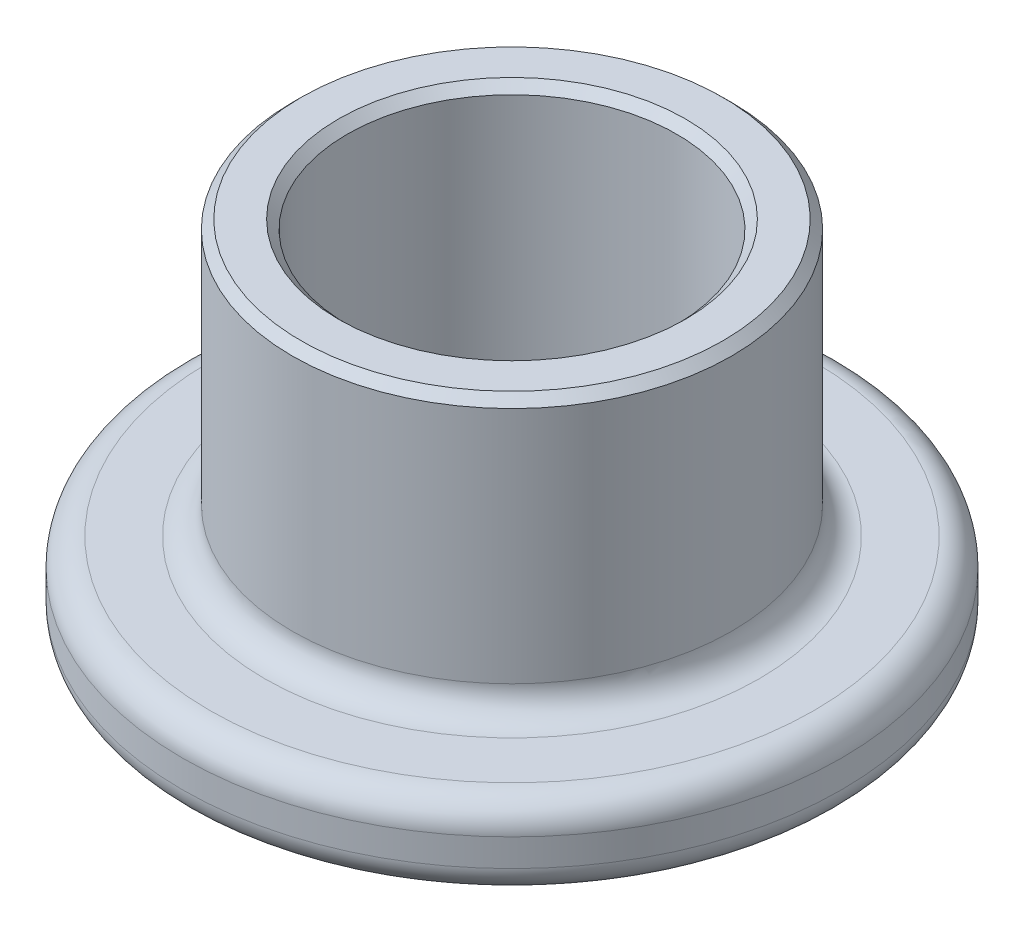
ISO-10303-21;
HEADER;
FILE_DESCRIPTION(('STEP AP214'),'2;1');
FILE_NAME('part.step','',(''),(''),'','','');
FILE_SCHEMA(('AUTOMOTIVE_DESIGN { 1 0 10303 214 1 1 1 1 }'));
ENDSEC;
DATA;
#1=APPLICATION_CONTEXT('core data for automotive mechanical design processes');
#2=APPLICATION_PROTOCOL_DEFINITION('international standard','automotive_design',2000,#1);
#3=PRODUCT_CONTEXT('',#1,'mechanical');
#4=PRODUCT('Part','Part','',(#3));
#5=PRODUCT_RELATED_PRODUCT_CATEGORY('part','',(#4));
#6=PRODUCT_DEFINITION_FORMATION('','',#4);
#7=PRODUCT_DEFINITION_CONTEXT('part definition',#1,'design');
#8=PRODUCT_DEFINITION('design','',#6,#7);
#9=PRODUCT_DEFINITION_SHAPE('','',#8);
#10=(LENGTH_UNIT() NAMED_UNIT(*) SI_UNIT(.MILLI.,.METRE.));
#11=(NAMED_UNIT(*) PLANE_ANGLE_UNIT() SI_UNIT($,.RADIAN.));
#12=(NAMED_UNIT(*) SI_UNIT($,.STERADIAN.) SOLID_ANGLE_UNIT());
#13=UNCERTAINTY_MEASURE_WITH_UNIT(LENGTH_MEASURE(1.E-05),#10,'distance_accuracy_value','');
#14=(GEOMETRIC_REPRESENTATION_CONTEXT(3) GLOBAL_UNCERTAINTY_ASSIGNED_CONTEXT((#13)) GLOBAL_UNIT_ASSIGNED_CONTEXT((#10,
#11,#12)) REPRESENTATION_CONTEXT('',''));
#15=CARTESIAN_POINT('',(0.,0.,0.));
#16=DIRECTION('',(0.,0.,1.));
#17=DIRECTION('',(1.,0.,0.));
#18=AXIS2_PLACEMENT_3D('',#15,#16,#17);
#19=CARTESIAN_POINT('',(0.,1.89666781767956,0.));
#20=DIRECTION('',(0.,1.,0.));
#21=DIRECTION('',(-1.,0.,0.));
#22=AXIS2_PLACEMENT_3D('',#19,#20,#21);
#23=CYLINDRICAL_SURFACE('',#22,2.38125);
#24=CARTESIAN_POINT('',(0.,0.127000000000002,0.));
#25=DIRECTION('',(0.,1.,0.));
#26=DIRECTION('',(-1.,0.,0.));
#27=AXIS2_PLACEMENT_3D('',#24,#25,#26);
#28=CIRCLE('',#27,2.38125);
#29=CARTESIAN_POINT('',(-2.38125,0.127000000000002,0.));
#30=VERTEX_POINT('',#29);
#31=EDGE_CURVE('E47',#30,#30,#28,.F.);
#32=ORIENTED_EDGE('',*,*,#31,.T.);
#33=EDGE_LOOP('',(#32));
#34=FACE_BOUND('',#33,.T.);
#35=CARTESIAN_POINT('',(0.,5.032375,0.));
#36=DIRECTION('',(0.,-1.,0.));
#37=DIRECTION('',(1.,0.,0.));
#38=AXIS2_PLACEMENT_3D('',#35,#36,#37);
#39=CIRCLE('',#38,2.38125);
#40=CARTESIAN_POINT('',(2.38125,5.032375,0.));
#41=VERTEX_POINT('',#40);
#42=EDGE_CURVE('E52',#41,#41,#39,.F.);
#43=ORIENTED_EDGE('',*,*,#42,.T.);
#44=EDGE_LOOP('',(#43));
#45=FACE_BOUND('',#44,.T.);
#46=ADVANCED_FACE('F32',(#34,#45),#23,.F.);
#47=CARTESIAN_POINT('',(2.38125,0.,0.));
#48=DIRECTION('',(0.,1.,0.));
#49=DIRECTION('',(-1.,0.,0.));
#50=AXIS2_PLACEMENT_3D('',#47,#48,#49);
#51=PLANE('',#50);
#52=CARTESIAN_POINT('',(0.,0.,0.));
#53=DIRECTION('',(0.,1.,0.));
#54=DIRECTION('',(-1.,0.,0.));
#55=AXIS2_PLACEMENT_3D('',#52,#53,#54);
#56=CIRCLE('',#55,2.50825);
#57=CARTESIAN_POINT('',(-2.50825,0.,0.));
#58=VERTEX_POINT('',#57);
#59=EDGE_CURVE('E55',#58,#58,#56,.T.);
#60=ORIENTED_EDGE('',*,*,#59,.T.);
#61=EDGE_LOOP('',(#60));
#62=FACE_BOUND('',#61,.T.);
#63=CARTESIAN_POINT('',(0.,0.,0.));
#64=DIRECTION('',(0.,1.,0.));
#65=DIRECTION('',(-1.,0.,0.));
#66=AXIS2_PLACEMENT_3D('',#63,#64,#65);
#67=CIRCLE('',#66,4.365625);
#68=CARTESIAN_POINT('',(-4.365625,0.,0.));
#69=VERTEX_POINT('',#68);
#70=EDGE_CURVE('E67',#69,#69,#67,.F.);
#71=ORIENTED_EDGE('',*,*,#70,.T.);
#72=EDGE_LOOP('',(#71));
#73=FACE_BOUND('',#72,.T.);
#74=ADVANCED_FACE('F108',(#62,#73),#51,.F.);
#75=CARTESIAN_POINT('',(0.,1.89666781767956,0.));
#76=DIRECTION('',(0.,1.,0.));
#77=DIRECTION('',(-1.,0.,0.));
#78=AXIS2_PLACEMENT_3D('',#75,#76,#77);
#79=CYLINDRICAL_SURFACE('',#78,4.7625);
#80=CARTESIAN_POINT('',(0.,0.396875,0.));
#81=DIRECTION('',(0.,1.,0.));
#82=DIRECTION('',(-1.,0.,0.));
#83=AXIS2_PLACEMENT_3D('',#80,#81,#82);
#84=CIRCLE('',#83,4.7625);
#85=CARTESIAN_POINT('',(-4.7625,0.396874999999999,0.));
#86=VERTEX_POINT('',#85);
#87=EDGE_CURVE('E70',#86,#86,#84,.T.);
#88=ORIENTED_EDGE('',*,*,#87,.T.);
#89=EDGE_LOOP('',(#88));
#90=FACE_BOUND('',#89,.T.);
#91=CARTESIAN_POINT('',(0.,0.793749999999999,0.));
#92=DIRECTION('',(0.,-1.,0.));
#93=DIRECTION('',(1.,0.,0.));
#94=AXIS2_PLACEMENT_3D('',#91,#92,#93);
#95=CIRCLE('',#94,4.7625);
#96=CARTESIAN_POINT('',(4.7625,0.79375,0.));
#97=VERTEX_POINT('',#96);
#98=EDGE_CURVE('E73',#97,#97,#95,.T.);
#99=ORIENTED_EDGE('',*,*,#98,.T.);
#100=EDGE_LOOP('',(#99));
#101=FACE_BOUND('',#100,.T.);
#102=ADVANCED_FACE('F77',(#90,#101),#79,.T.);
#103=CARTESIAN_POINT('',(4.7625,1.190625,0.));
#104=DIRECTION('',(0.,-1.,0.));
#105=DIRECTION('',(1.,0.,0.));
#106=AXIS2_PLACEMENT_3D('',#103,#104,#105);
#107=PLANE('',#106);
#108=CARTESIAN_POINT('',(0.,1.190625,0.));
#109=DIRECTION('',(0.,-1.,0.));
#110=DIRECTION('',(1.,0.,0.));
#111=AXIS2_PLACEMENT_3D('',#108,#109,#110);
#112=CIRCLE('',#111,4.365625);
#113=CARTESIAN_POINT('',(4.365625,1.190625,0.));
#114=VERTEX_POINT('',#113);
#115=EDGE_CURVE('E61',#114,#114,#112,.F.);
#116=ORIENTED_EDGE('',*,*,#115,.T.);
#117=EDGE_LOOP('',(#116));
#118=FACE_BOUND('',#117,.T.);
#119=CARTESIAN_POINT('',(0.,1.190625,0.));
#120=DIRECTION('',(0.,-1.,0.));
#121=DIRECTION('',(1.,0.,0.));
#122=AXIS2_PLACEMENT_3D('',#119,#120,#121);
#123=CIRCLE('',#122,3.571875);
#124=CARTESIAN_POINT('',(3.571875,1.190625,0.));
#125=VERTEX_POINT('',#124);
#126=EDGE_CURVE('E64',#125,#125,#123,.T.);
#127=ORIENTED_EDGE('',*,*,#126,.T.);
#128=EDGE_LOOP('',(#127));
#129=FACE_BOUND('',#128,.T.);
#130=ADVANCED_FACE('F87',(#118,#129),#107,.F.);
#131=CARTESIAN_POINT('',(0.,1.89666781767956,0.));
#132=DIRECTION('',(0.,1.,0.));
#133=DIRECTION('',(-1.,0.,0.));
#134=AXIS2_PLACEMENT_3D('',#131,#132,#133);
#135=CYLINDRICAL_SURFACE('',#134,3.175);
#136=CARTESIAN_POINT('',(0.,5.032375,0.));
#137=DIRECTION('',(0.,-1.,0.));
#138=DIRECTION('',(1.,0.,0.));
#139=AXIS2_PLACEMENT_3D('',#136,#137,#138);
#140=CIRCLE('',#139,3.175);
#141=CARTESIAN_POINT('',(3.175,5.032375,0.));
#142=VERTEX_POINT('',#141);
#143=EDGE_CURVE('E10',#142,#142,#140,.T.);
#144=ORIENTED_EDGE('',*,*,#143,.T.);
#145=EDGE_LOOP('',(#144));
#146=FACE_BOUND('',#145,.T.);
#147=CARTESIAN_POINT('',(0.,1.5875,0.));
#148=DIRECTION('',(0.,-1.,0.));
#149=DIRECTION('',(1.,0.,0.));
#150=AXIS2_PLACEMENT_3D('',#147,#148,#149);
#151=CIRCLE('',#150,3.175);
#152=CARTESIAN_POINT('',(3.175,1.5875,0.));
#153=VERTEX_POINT('',#152);
#154=EDGE_CURVE('E58',#153,#153,#151,.F.);
#155=ORIENTED_EDGE('',*,*,#154,.T.);
#156=EDGE_LOOP('',(#155));
#157=FACE_BOUND('',#156,.T.);
#158=ADVANCED_FACE('F90',(#146,#157),#135,.T.);
#159=CARTESIAN_POINT('',(3.175,5.159375,0.));
#160=DIRECTION('',(0.,-1.,0.));
#161=DIRECTION('',(1.,0.,0.));
#162=AXIS2_PLACEMENT_3D('',#159,#160,#161);
#163=PLANE('',#162);
#164=CARTESIAN_POINT('',(0.,5.159375,0.));
#165=DIRECTION('',(0.,-1.,0.));
#166=DIRECTION('',(1.,0.,0.));
#167=AXIS2_PLACEMENT_3D('',#164,#165,#166);
#168=CIRCLE('',#167,3.048);
#169=CARTESIAN_POINT('',(3.048,5.159375,0.));
#170=VERTEX_POINT('',#169);
#171=EDGE_CURVE('E39',#170,#170,#168,.F.);
#172=ORIENTED_EDGE('',*,*,#171,.T.);
#173=EDGE_LOOP('',(#172));
#174=FACE_BOUND('',#173,.T.);
#175=CARTESIAN_POINT('',(0.,5.159375,0.));
#176=DIRECTION('',(0.,-1.,0.));
#177=DIRECTION('',(1.,0.,0.));
#178=AXIS2_PLACEMENT_3D('',#175,#176,#177);
#179=CIRCLE('',#178,2.50825);
#180=CARTESIAN_POINT('',(2.50825,5.159375,0.));
#181=VERTEX_POINT('',#180);
#182=EDGE_CURVE('E43',#181,#181,#179,.T.);
#183=ORIENTED_EDGE('',*,*,#182,.T.);
#184=EDGE_LOOP('',(#183));
#185=FACE_BOUND('',#184,.T.);
#186=ADVANCED_FACE('F101',(#174,#185),#163,.F.);
#187=CARTESIAN_POINT('',(0.,0.396875,0.));
#188=DIRECTION('',(0.,1.,0.));
#189=DIRECTION('',(-1.,0.,0.));
#190=AXIS2_PLACEMENT_3D('',#187,#188,#189);
#191=TOROIDAL_SURFACE('',#190,4.365625,0.396875);
#192=ORIENTED_EDGE('',*,*,#70,.F.);
#193=EDGE_LOOP('',(#192));
#194=FACE_BOUND('',#193,.T.);
#195=ORIENTED_EDGE('',*,*,#87,.F.);
#196=EDGE_LOOP('',(#195));
#197=FACE_BOUND('',#196,.T.);
#198=ADVANCED_FACE('F83',(#194,#197),#191,.T.);
#199=CARTESIAN_POINT('',(0.,0.793749999999999,0.));
#200=DIRECTION('',(0.,-1.,0.));
#201=DIRECTION('',(1.,0.,0.));
#202=AXIS2_PLACEMENT_3D('',#199,#200,#201);
#203=TOROIDAL_SURFACE('',#202,4.365625,0.396875);
#204=ORIENTED_EDGE('',*,*,#98,.F.);
#205=EDGE_LOOP('',(#204));
#206=FACE_BOUND('',#205,.T.);
#207=ORIENTED_EDGE('',*,*,#115,.F.);
#208=EDGE_LOOP('',(#207));
#209=FACE_BOUND('',#208,.T.);
#210=ADVANCED_FACE('F79',(#206,#209),#203,.T.);
#211=CARTESIAN_POINT('',(0.,1.5875,0.));
#212=DIRECTION('',(0.,-1.,0.));
#213=DIRECTION('',(1.,0.,0.));
#214=AXIS2_PLACEMENT_3D('',#211,#212,#213);
#215=TOROIDAL_SURFACE('',#214,3.571875,0.396875);
#216=ORIENTED_EDGE('',*,*,#126,.F.);
#217=EDGE_LOOP('',(#216));
#218=FACE_BOUND('',#217,.T.);
#219=ORIENTED_EDGE('',*,*,#154,.F.);
#220=EDGE_LOOP('',(#219));
#221=FACE_BOUND('',#220,.T.);
#222=ADVANCED_FACE('F82',(#218,#221),#215,.F.);
#223=CARTESIAN_POINT('',(0.,0.,0.));
#224=DIRECTION('',(0.,-1.,0.));
#225=DIRECTION('',(1.,0.,0.));
#226=AXIS2_PLACEMENT_3D('',#223,#224,#225);
#227=CONICAL_SURFACE('',#226,2.50825,0.785398163397448);
#228=ORIENTED_EDGE('',*,*,#31,.F.);
#229=EDGE_LOOP('',(#228));
#230=FACE_BOUND('',#229,.T.);
#231=ORIENTED_EDGE('',*,*,#59,.F.);
#232=EDGE_LOOP('',(#231));
#233=FACE_BOUND('',#232,.T.);
#234=ADVANCED_FACE('F96',(#230,#233),#227,.F.);
#235=CARTESIAN_POINT('',(0.,5.159375,0.));
#236=DIRECTION('',(0.,-1.,0.));
#237=DIRECTION('',(1.,0.,0.));
#238=AXIS2_PLACEMENT_3D('',#235,#236,#237);
#239=CONICAL_SURFACE('',#238,3.048,0.78539816339744);
#240=ORIENTED_EDGE('',*,*,#143,.F.);
#241=EDGE_LOOP('',(#240));
#242=FACE_BOUND('',#241,.T.);
#243=ORIENTED_EDGE('',*,*,#171,.F.);
#244=EDGE_LOOP('',(#243));
#245=FACE_BOUND('',#244,.T.);
#246=ADVANCED_FACE('F123',(#242,#245),#239,.T.);
#247=CARTESIAN_POINT('',(0.,5.032375,0.));
#248=DIRECTION('',(0.,1.,0.));
#249=DIRECTION('',(-1.,0.,0.));
#250=AXIS2_PLACEMENT_3D('',#247,#248,#249);
#251=CONICAL_SURFACE('',#250,2.38125,0.785398163397445);
#252=ORIENTED_EDGE('',*,*,#182,.F.);
#253=EDGE_LOOP('',(#252));
#254=FACE_BOUND('',#253,.T.);
#255=ORIENTED_EDGE('',*,*,#42,.F.);
#256=EDGE_LOOP('',(#255));
#257=FACE_BOUND('',#256,.T.);
#258=ADVANCED_FACE('F34',(#254,#257),#251,.F.);
#259=CLOSED_SHELL('',(#46,#74,#102,#130,#158,#186,#198,#210,#222,#234,#246,#258));
#260=MANIFOLD_SOLID_BREP('B2',#259);
#261=ADVANCED_BREP_SHAPE_REPRESENTATION('',(#18,#260),#14);
#262=SHAPE_DEFINITION_REPRESENTATION(#9,#261);
ENDSEC;
END-ISO-10303-21;
